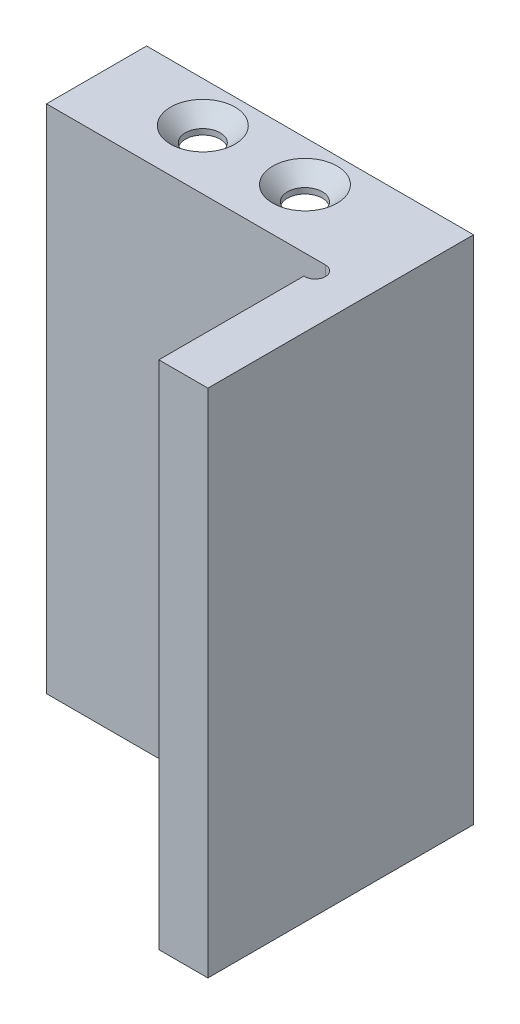
ISO-10303-21;
HEADER;
FILE_DESCRIPTION(('STEP AP214'),'2;1');
FILE_NAME('part.step','',(''),(''),'','','');
FILE_SCHEMA(('AUTOMOTIVE_DESIGN { 1 0 10303 214 1 1 1 1 }'));
ENDSEC;
DATA;
#1=APPLICATION_CONTEXT('core data for automotive mechanical design processes');
#2=APPLICATION_PROTOCOL_DEFINITION('international standard','automotive_design',2000,#1);
#3=PRODUCT_CONTEXT('',#1,'mechanical');
#4=PRODUCT('Part','Part','',(#3));
#5=PRODUCT_RELATED_PRODUCT_CATEGORY('part','',(#4));
#6=PRODUCT_DEFINITION_FORMATION('','',#4);
#7=PRODUCT_DEFINITION_CONTEXT('part definition',#1,'design');
#8=PRODUCT_DEFINITION('design','',#6,#7);
#9=PRODUCT_DEFINITION_SHAPE('','',#8);
#10=(LENGTH_UNIT() NAMED_UNIT(*) SI_UNIT(.MILLI.,.METRE.));
#11=(NAMED_UNIT(*) PLANE_ANGLE_UNIT() SI_UNIT($,.RADIAN.));
#12=(NAMED_UNIT(*) SI_UNIT($,.STERADIAN.) SOLID_ANGLE_UNIT());
#13=UNCERTAINTY_MEASURE_WITH_UNIT(LENGTH_MEASURE(1.E-05),#10,'distance_accuracy_value','');
#14=(GEOMETRIC_REPRESENTATION_CONTEXT(3) GLOBAL_UNCERTAINTY_ASSIGNED_CONTEXT((#13)) GLOBAL_UNIT_ASSIGNED_CONTEXT((#10,
#11,#12)) REPRESENTATION_CONTEXT('',''));
#15=CARTESIAN_POINT('',(0.,0.,0.));
#16=DIRECTION('',(0.,0.,1.));
#17=DIRECTION('',(1.,0.,0.));
#18=AXIS2_PLACEMENT_3D('',#15,#16,#17);
#19=CARTESIAN_POINT('',(11.2,-48.,-3.19999999999997));
#20=DIRECTION('',(0.,0.,-1.));
#21=DIRECTION('',(-1.,0.,0.));
#22=AXIS2_PLACEMENT_3D('',#19,#20,#21);
#23=PLANE('',#22);
#24=DIRECTION('',(-1.,0.,0.));
#25=VECTOR('',#24,1.);
#26=CARTESIAN_POINT('',(11.2,-48.,-3.19999999999997));
#27=LINE('',#26,#25);
#28=CARTESIAN_POINT('',(11.3,-48.,-3.19999999999997));
#29=VERTEX_POINT('',#28);
#30=CARTESIAN_POINT('',(-16.,-48.,-3.19999999999997));
#31=VERTEX_POINT('',#30);
#32=EDGE_CURVE('E144',#29,#31,#27,.T.);
#33=ORIENTED_EDGE('',*,*,#32,.F.);
#34=DIRECTION('',(0.,1.,0.));
#35=VECTOR('',#34,1.);
#36=CARTESIAN_POINT('',(11.3,2.,-3.19999999999997));
#37=LINE('',#36,#35);
#38=CARTESIAN_POINT('',(11.3,2.,-3.2));
#39=VERTEX_POINT('',#38);
#40=EDGE_CURVE('E208',#29,#39,#37,.T.);
#41=ORIENTED_EDGE('',*,*,#40,.T.);
#42=DIRECTION('',(-1.,0.,0.));
#43=VECTOR('',#42,1.);
#44=CARTESIAN_POINT('',(11.2,2.,-3.2));
#45=LINE('',#44,#43);
#46=CARTESIAN_POINT('',(-16.,2.,-3.2));
#47=VERTEX_POINT('',#46);
#48=EDGE_CURVE('E156',#39,#47,#45,.T.);
#49=ORIENTED_EDGE('',*,*,#48,.T.);
#50=DIRECTION('',(0.,1.,0.));
#51=VECTOR('',#50,1.);
#52=CARTESIAN_POINT('',(-16.,-48.,-3.19999999999997));
#53=LINE('',#52,#51);
#54=EDGE_CURVE('E146',#31,#47,#53,.T.);
#55=ORIENTED_EDGE('',*,*,#54,.F.);
#56=EDGE_LOOP('',(#33,#41,#49,#55));
#57=FACE_BOUND('',#56,.T.);
#58=CARTESIAN_POINT('',(-1.,-42.5,-3.19999999999997));
#59=DIRECTION('',(0.,0.,1.));
#60=DIRECTION('',(1.,0.,0.));
#61=AXIS2_PLACEMENT_3D('',#58,#59,#60);
#62=CIRCLE('',#61,1.6);
#63=CARTESIAN_POINT('',(0.599999999999995,-42.5,-3.19999999999997));
#64=VERTEX_POINT('',#63);
#65=EDGE_CURVE('E137',#64,#64,#62,.T.);
#66=ORIENTED_EDGE('',*,*,#65,.F.);
#67=EDGE_LOOP('',(#66));
#68=FACE_BOUND('',#67,.T.);
#69=ADVANCED_FACE('F32',(#57,#68),#23,.F.);
#70=CARTESIAN_POINT('',(0.,0.,0.));
#71=DIRECTION('',(0.,1.,0.));
#72=DIRECTION('',(0.,0.,1.));
#73=AXIS2_PLACEMENT_3D('',#70,#71,#72);
#74=PLANE('',#73);
#75=CARTESIAN_POINT('',(3.5,0.,-9.));
#76=DIRECTION('',(0.,1.,0.));
#77=DIRECTION('',(0.,0.,1.));
#78=AXIS2_PLACEMENT_3D('',#75,#76,#77);
#79=CIRCLE('',#78,1.69999999999999);
#80=CARTESIAN_POINT('',(3.5,0.,-7.30000000000001));
#81=VERTEX_POINT('',#80);
#82=EDGE_CURVE('E186',#81,#81,#79,.T.);
#83=ORIENTED_EDGE('',*,*,#82,.T.);
#84=EDGE_LOOP('',(#83));
#85=FACE_BOUND('',#84,.T.);
#86=CARTESIAN_POINT('',(-6.5,0.,-9.));
#87=DIRECTION('',(0.,1.,0.));
#88=DIRECTION('',(0.,0.,1.));
#89=AXIS2_PLACEMENT_3D('',#86,#87,#88);
#90=CIRCLE('',#89,1.69999999999999);
#91=CARTESIAN_POINT('',(-6.5,0.,-7.3));
#92=VERTEX_POINT('',#91);
#93=EDGE_CURVE('E179',#92,#92,#90,.T.);
#94=ORIENTED_EDGE('',*,*,#93,.T.);
#95=EDGE_LOOP('',(#94));
#96=FACE_BOUND('',#95,.T.);
#97=DIRECTION('',(0.,0.,-1.));
#98=VECTOR('',#97,1.);
#99=CARTESIAN_POINT('',(14.,0.,-5.));
#100=LINE('',#99,#98);
#101=CARTESIAN_POINT('',(14.,0.,-5.));
#102=VERTEX_POINT('',#101);
#103=CARTESIAN_POINT('',(14.,0.,-13.));
#104=VERTEX_POINT('',#103);
#105=EDGE_CURVE('E155',#102,#104,#100,.T.);
#106=ORIENTED_EDGE('',*,*,#105,.F.);
#107=DIRECTION('',(1.,0.,0.));
#108=VECTOR('',#107,1.);
#109=CARTESIAN_POINT('',(14.,0.,-5.));
#110=LINE('',#109,#108);
#111=CARTESIAN_POINT('',(-16.,0.,-5.00000000000001));
#112=VERTEX_POINT('',#111);
#113=EDGE_CURVE('E152',#112,#102,#110,.T.);
#114=ORIENTED_EDGE('',*,*,#113,.F.);
#115=DIRECTION('',(0.,0.,1.));
#116=VECTOR('',#115,1.);
#117=CARTESIAN_POINT('',(-16.,0.,-13.));
#118=LINE('',#117,#116);
#119=CARTESIAN_POINT('',(-16.,0.,-13.));
#120=VERTEX_POINT('',#119);
#121=EDGE_CURVE('E198',#120,#112,#118,.T.);
#122=ORIENTED_EDGE('',*,*,#121,.F.);
#123=DIRECTION('',(-1.,0.,0.));
#124=VECTOR('',#123,1.);
#125=CARTESIAN_POINT('',(-16.,0.,-13.));
#126=LINE('',#125,#124);
#127=EDGE_CURVE('E191',#104,#120,#126,.T.);
#128=ORIENTED_EDGE('',*,*,#127,.F.);
#129=EDGE_LOOP('',(#106,#114,#122,#128));
#130=FACE_BOUND('',#129,.T.);
#131=ADVANCED_FACE('F266',(#85,#96,#130),#74,.F.);
#132=CARTESIAN_POINT('',(-16.,2.,-13.));
#133=DIRECTION('',(1.,0.,0.));
#134=DIRECTION('',(0.,0.,-1.));
#135=AXIS2_PLACEMENT_3D('',#132,#133,#134);
#136=PLANE('',#135);
#137=ORIENTED_EDGE('',*,*,#54,.T.);
#138=DIRECTION('',(0.,0.,1.));
#139=VECTOR('',#138,1.);
#140=CARTESIAN_POINT('',(-16.,2.,-13.));
#141=LINE('',#140,#139);
#142=CARTESIAN_POINT('',(-16.,2.,-13.));
#143=VERTEX_POINT('',#142);
#144=EDGE_CURVE('E187',#143,#47,#141,.T.);
#145=ORIENTED_EDGE('',*,*,#144,.F.);
#146=DIRECTION('',(0.,-1.,0.));
#147=VECTOR('',#146,1.);
#148=CARTESIAN_POINT('',(-16.,2.,-13.));
#149=LINE('',#148,#147);
#150=EDGE_CURVE('E197',#143,#120,#149,.T.);
#151=ORIENTED_EDGE('',*,*,#150,.T.);
#152=ORIENTED_EDGE('',*,*,#121,.T.);
#153=DIRECTION('',(0.,1.,0.));
#154=VECTOR('',#153,1.);
#155=CARTESIAN_POINT('',(-16.,-48.,-5.00000000000001));
#156=LINE('',#155,#154);
#157=CARTESIAN_POINT('',(-16.,-48.,-5.00000000000001));
#158=VERTEX_POINT('',#157);
#159=EDGE_CURVE('E170',#158,#112,#156,.T.);
#160=ORIENTED_EDGE('',*,*,#159,.F.);
#161=DIRECTION('',(0.,0.,-1.));
#162=VECTOR('',#161,1.);
#163=CARTESIAN_POINT('',(-16.,-48.,-5.00000000000001));
#164=LINE('',#163,#162);
#165=EDGE_CURVE('E159',#31,#158,#164,.T.);
#166=ORIENTED_EDGE('',*,*,#165,.F.);
#167=EDGE_LOOP('',(#137,#145,#151,#152,#160,#166));
#168=FACE_BOUND('',#167,.T.);
#169=ADVANCED_FACE('F237',(#168),#136,.F.);
#170=CARTESIAN_POINT('',(-16.,2.,13.));
#171=DIRECTION('',(0.,0.,-1.));
#172=DIRECTION('',(-1.,0.,0.));
#173=AXIS2_PLACEMENT_3D('',#170,#171,#172);
#174=PLANE('',#173);
#175=DIRECTION('',(1.,0.,0.));
#176=VECTOR('',#175,1.);
#177=CARTESIAN_POINT('',(-16.,2.,13.));
#178=LINE('',#177,#176);
#179=CARTESIAN_POINT('',(11.2,2.,13.));
#180=VERTEX_POINT('',#179);
#181=CARTESIAN_POINT('',(16.,2.,13.));
#182=VERTEX_POINT('',#181);
#183=EDGE_CURVE('E190',#180,#182,#178,.T.);
#184=ORIENTED_EDGE('',*,*,#183,.F.);
#185=DIRECTION('',(0.,1.,0.));
#186=VECTOR('',#185,1.);
#187=CARTESIAN_POINT('',(11.2,-48.,13.));
#188=LINE('',#187,#186);
#189=CARTESIAN_POINT('',(11.2,-48.,13.));
#190=VERTEX_POINT('',#189);
#191=EDGE_CURVE('E162',#190,#180,#188,.T.);
#192=ORIENTED_EDGE('',*,*,#191,.F.);
#193=DIRECTION('',(-1.,0.,0.));
#194=VECTOR('',#193,1.);
#195=CARTESIAN_POINT('',(11.2,-48.,13.));
#196=LINE('',#195,#194);
#197=CARTESIAN_POINT('',(16.,-48.,13.));
#198=VERTEX_POINT('',#197);
#199=EDGE_CURVE('E142',#198,#190,#196,.T.);
#200=ORIENTED_EDGE('',*,*,#199,.F.);
#201=DIRECTION('',(0.,-1.,0.));
#202=VECTOR('',#201,1.);
#203=CARTESIAN_POINT('',(16.,2.,13.));
#204=LINE('',#203,#202);
#205=EDGE_CURVE('E206',#182,#198,#204,.T.);
#206=ORIENTED_EDGE('',*,*,#205,.F.);
#207=EDGE_LOOP('',(#184,#192,#200,#206));
#208=FACE_BOUND('',#207,.T.);
#209=ADVANCED_FACE('F255',(#208),#174,.F.);
#210=CARTESIAN_POINT('',(16.,2.,-13.));
#211=DIRECTION('',(-1.,0.,0.));
#212=DIRECTION('',(0.,0.,1.));
#213=AXIS2_PLACEMENT_3D('',#210,#211,#212);
#214=PLANE('',#213);
#215=ORIENTED_EDGE('',*,*,#205,.T.);
#216=DIRECTION('',(0.,0.,1.));
#217=VECTOR('',#216,1.);
#218=CARTESIAN_POINT('',(16.,-48.,13.));
#219=LINE('',#218,#217);
#220=CARTESIAN_POINT('',(16.,-48.,-13.));
#221=VERTEX_POINT('',#220);
#222=EDGE_CURVE('E148',#221,#198,#219,.T.);
#223=ORIENTED_EDGE('',*,*,#222,.F.);
#224=DIRECTION('',(0.,-1.,0.));
#225=VECTOR('',#224,1.);
#226=CARTESIAN_POINT('',(16.,2.,-13.));
#227=LINE('',#226,#225);
#228=CARTESIAN_POINT('',(16.,2.,-13.));
#229=VERTEX_POINT('',#228);
#230=EDGE_CURVE('E204',#229,#221,#227,.T.);
#231=ORIENTED_EDGE('',*,*,#230,.F.);
#232=DIRECTION('',(0.,0.,-1.));
#233=VECTOR('',#232,1.);
#234=CARTESIAN_POINT('',(16.,2.,-13.));
#235=LINE('',#234,#233);
#236=EDGE_CURVE('E193',#182,#229,#235,.T.);
#237=ORIENTED_EDGE('',*,*,#236,.F.);
#238=EDGE_LOOP('',(#215,#223,#231,#237));
#239=FACE_BOUND('',#238,.T.);
#240=ADVANCED_FACE('F307',(#239),#214,.F.);
#241=CARTESIAN_POINT('',(-16.,2.,-13.));
#242=DIRECTION('',(0.,0.,1.));
#243=DIRECTION('',(1.,0.,0.));
#244=AXIS2_PLACEMENT_3D('',#241,#242,#243);
#245=PLANE('',#244);
#246=ORIENTED_EDGE('',*,*,#230,.T.);
#247=DIRECTION('',(1.,0.,0.));
#248=VECTOR('',#247,1.);
#249=CARTESIAN_POINT('',(14.,-48.,-13.));
#250=LINE('',#249,#248);
#251=CARTESIAN_POINT('',(14.,-48.,-13.));
#252=VERTEX_POINT('',#251);
#253=EDGE_CURVE('E246',#252,#221,#250,.T.);
#254=ORIENTED_EDGE('',*,*,#253,.F.);
#255=DIRECTION('',(0.,1.,0.));
#256=VECTOR('',#255,1.);
#257=CARTESIAN_POINT('',(14.,-48.,-13.));
#258=LINE('',#257,#256);
#259=EDGE_CURVE('E164',#252,#104,#258,.T.);
#260=ORIENTED_EDGE('',*,*,#259,.T.);
#261=ORIENTED_EDGE('',*,*,#127,.T.);
#262=ORIENTED_EDGE('',*,*,#150,.F.);
#263=DIRECTION('',(-1.,0.,0.));
#264=VECTOR('',#263,1.);
#265=CARTESIAN_POINT('',(-16.,2.,-13.));
#266=LINE('',#265,#264);
#267=EDGE_CURVE('E195',#229,#143,#266,.T.);
#268=ORIENTED_EDGE('',*,*,#267,.F.);
#269=EDGE_LOOP('',(#246,#254,#260,#261,#262,#268));
#270=FACE_BOUND('',#269,.T.);
#271=ADVANCED_FACE('F303',(#270),#245,.F.);
#272=CARTESIAN_POINT('',(0.,2.,0.));
#273=DIRECTION('',(0.,1.,0.));
#274=DIRECTION('',(0.,0.,1.));
#275=AXIS2_PLACEMENT_3D('',#272,#273,#274);
#276=PLANE('',#275);
#277=CARTESIAN_POINT('',(11.3,2.,-2.19999999999997));
#278=DIRECTION('',(0.,1.,0.));
#279=DIRECTION('',(0.,0.,1.));
#280=AXIS2_PLACEMENT_3D('',#277,#278,#279);
#281=CIRCLE('',#280,1.);
#282=CARTESIAN_POINT('',(12.3,2.,-2.19999999999997));
#283=VERTEX_POINT('',#282);
#284=EDGE_CURVE('E54',#39,#283,#281,.F.);
#285=ORIENTED_EDGE('',*,*,#284,.T.);
#286=CARTESIAN_POINT('',(11.3,2.,-2.2));
#287=DIRECTION('',(0.,1.,0.));
#288=DIRECTION('',(0.,0.,1.));
#289=AXIS2_PLACEMENT_3D('',#286,#287,#288);
#290=CIRCLE('',#289,1.);
#291=CARTESIAN_POINT('',(11.3,2.,-1.2));
#292=VERTEX_POINT('',#291);
#293=EDGE_CURVE('E41',#283,#292,#290,.F.);
#294=ORIENTED_EDGE('',*,*,#293,.T.);
#295=DIRECTION('',(1.,0.,0.));
#296=VECTOR('',#295,1.);
#297=CARTESIAN_POINT('',(11.2,2.,-1.2));
#298=LINE('',#297,#296);
#299=CARTESIAN_POINT('',(11.2,2.,-1.2));
#300=VERTEX_POINT('',#299);
#301=EDGE_CURVE('E128',#300,#292,#298,.T.);
#302=ORIENTED_EDGE('',*,*,#301,.F.);
#303=DIRECTION('',(0.,0.,-1.));
#304=VECTOR('',#303,1.);
#305=CARTESIAN_POINT('',(11.2,2.,-3.2));
#306=LINE('',#305,#304);
#307=EDGE_CURVE('E136',#180,#300,#306,.T.);
#308=ORIENTED_EDGE('',*,*,#307,.F.);
#309=ORIENTED_EDGE('',*,*,#183,.T.);
#310=ORIENTED_EDGE('',*,*,#236,.T.);
#311=ORIENTED_EDGE('',*,*,#267,.T.);
#312=ORIENTED_EDGE('',*,*,#144,.T.);
#313=ORIENTED_EDGE('',*,*,#48,.F.);
#314=EDGE_LOOP('',(#285,#294,#302,#308,#309,#310,#311,#312,#313));
#315=FACE_BOUND('',#314,.T.);
#316=CARTESIAN_POINT('',(-6.5,2.,-9.));
#317=DIRECTION('',(0.,1.,0.));
#318=DIRECTION('',(0.,0.,1.));
#319=AXIS2_PLACEMENT_3D('',#316,#317,#318);
#320=CIRCLE('',#319,3.15);
#321=CARTESIAN_POINT('',(-6.5,2.,-5.85));
#322=VERTEX_POINT('',#321);
#323=EDGE_CURVE('E173',#322,#322,#320,.T.);
#324=ORIENTED_EDGE('',*,*,#323,.F.);
#325=EDGE_LOOP('',(#324));
#326=FACE_BOUND('',#325,.T.);
#327=CARTESIAN_POINT('',(3.5,2.,-9.));
#328=DIRECTION('',(0.,1.,0.));
#329=DIRECTION('',(0.,0.,1.));
#330=AXIS2_PLACEMENT_3D('',#327,#328,#329);
#331=CIRCLE('',#330,3.15);
#332=CARTESIAN_POINT('',(3.5,2.,-5.85));
#333=VERTEX_POINT('',#332);
#334=EDGE_CURVE('E180',#333,#333,#331,.T.);
#335=ORIENTED_EDGE('',*,*,#334,.F.);
#336=EDGE_LOOP('',(#335));
#337=FACE_BOUND('',#336,.T.);
#338=ADVANCED_FACE('F219',(#315,#326,#337),#276,.T.);
#339=CARTESIAN_POINT('',(3.5,2.,-9.));
#340=DIRECTION('',(0.,1.,0.));
#341=DIRECTION('',(0.,0.,1.));
#342=AXIS2_PLACEMENT_3D('',#339,#340,#341);
#343=CYLINDRICAL_SURFACE('',#342,1.69999999999999);
#344=CARTESIAN_POINT('',(3.5,0.549999999999999,-9.));
#345=DIRECTION('',(0.,1.,0.));
#346=DIRECTION('',(0.,0.,1.));
#347=AXIS2_PLACEMENT_3D('',#344,#345,#346);
#348=CIRCLE('',#347,1.7);
#349=CARTESIAN_POINT('',(3.5,0.549999999999999,-7.3));
#350=VERTEX_POINT('',#349);
#351=EDGE_CURVE('E183',#350,#350,#348,.T.);
#352=ORIENTED_EDGE('',*,*,#351,.T.);
#353=EDGE_LOOP('',(#352));
#354=FACE_BOUND('',#353,.T.);
#355=ORIENTED_EDGE('',*,*,#82,.F.);
#356=EDGE_LOOP('',(#355));
#357=FACE_BOUND('',#356,.T.);
#358=ADVANCED_FACE('F297',(#354,#357),#343,.F.);
#359=CARTESIAN_POINT('',(3.5,2.,-9.));
#360=DIRECTION('',(0.,1.,0.));
#361=DIRECTION('',(0.,0.,1.));
#362=AXIS2_PLACEMENT_3D('',#359,#360,#361);
#363=CONICAL_SURFACE('',#362,3.15,0.785398163397448);
#364=ORIENTED_EDGE('',*,*,#351,.F.);
#365=EDGE_LOOP('',(#364));
#366=FACE_BOUND('',#365,.T.);
#367=ORIENTED_EDGE('',*,*,#334,.T.);
#368=EDGE_LOOP('',(#367));
#369=FACE_BOUND('',#368,.T.);
#370=ADVANCED_FACE('F293',(#366,#369),#363,.F.);
#371=CARTESIAN_POINT('',(-6.5,2.,-9.));
#372=DIRECTION('',(0.,1.,0.));
#373=DIRECTION('',(0.,0.,1.));
#374=AXIS2_PLACEMENT_3D('',#371,#372,#373);
#375=CYLINDRICAL_SURFACE('',#374,1.69999999999999);
#376=CARTESIAN_POINT('',(-6.5,0.549999999999999,-9.));
#377=DIRECTION('',(0.,1.,0.));
#378=DIRECTION('',(0.,0.,1.));
#379=AXIS2_PLACEMENT_3D('',#376,#377,#378);
#380=CIRCLE('',#379,1.7);
#381=CARTESIAN_POINT('',(-6.5,0.549999999999999,-7.3));
#382=VERTEX_POINT('',#381);
#383=EDGE_CURVE('E176',#382,#382,#380,.T.);
#384=ORIENTED_EDGE('',*,*,#383,.T.);
#385=EDGE_LOOP('',(#384));
#386=FACE_BOUND('',#385,.T.);
#387=ORIENTED_EDGE('',*,*,#93,.F.);
#388=EDGE_LOOP('',(#387));
#389=FACE_BOUND('',#388,.T.);
#390=ADVANCED_FACE('F289',(#386,#389),#375,.F.);
#391=CARTESIAN_POINT('',(-6.5,2.,-9.));
#392=DIRECTION('',(0.,1.,0.));
#393=DIRECTION('',(0.,0.,1.));
#394=AXIS2_PLACEMENT_3D('',#391,#392,#393);
#395=CONICAL_SURFACE('',#394,3.15,0.785398163397448);
#396=ORIENTED_EDGE('',*,*,#383,.F.);
#397=EDGE_LOOP('',(#396));
#398=FACE_BOUND('',#397,.T.);
#399=ORIENTED_EDGE('',*,*,#323,.T.);
#400=EDGE_LOOP('',(#399));
#401=FACE_BOUND('',#400,.T.);
#402=ADVANCED_FACE('F285',(#398,#401),#395,.F.);
#403=CARTESIAN_POINT('',(14.,-48.,-5.));
#404=DIRECTION('',(0.,0.,1.));
#405=DIRECTION('',(1.,0.,0.));
#406=AXIS2_PLACEMENT_3D('',#403,#404,#405);
#407=PLANE('',#406);
#408=CARTESIAN_POINT('',(-1.,-42.5,-5.00000000000001));
#409=DIRECTION('',(0.,0.,1.));
#410=DIRECTION('',(1.,0.,0.));
#411=AXIS2_PLACEMENT_3D('',#408,#409,#410);
#412=CIRCLE('',#411,1.6);
#413=CARTESIAN_POINT('',(0.599999999999997,-42.5,-5.00000000000001));
#414=VERTEX_POINT('',#413);
#415=EDGE_CURVE('E257',#414,#414,#412,.T.);
#416=ORIENTED_EDGE('',*,*,#415,.T.);
#417=EDGE_LOOP('',(#416));
#418=FACE_BOUND('',#417,.T.);
#419=ORIENTED_EDGE('',*,*,#113,.T.);
#420=DIRECTION('',(0.,1.,0.));
#421=VECTOR('',#420,1.);
#422=CARTESIAN_POINT('',(14.,-48.,-5.));
#423=LINE('',#422,#421);
#424=CARTESIAN_POINT('',(14.,-48.,-5.));
#425=VERTEX_POINT('',#424);
#426=EDGE_CURVE('E167',#425,#102,#423,.T.);
#427=ORIENTED_EDGE('',*,*,#426,.F.);
#428=DIRECTION('',(1.,0.,0.));
#429=VECTOR('',#428,1.);
#430=CARTESIAN_POINT('',(14.,-48.,-5.));
#431=LINE('',#430,#429);
#432=EDGE_CURVE('E238',#158,#425,#431,.T.);
#433=ORIENTED_EDGE('',*,*,#432,.F.);
#434=ORIENTED_EDGE('',*,*,#159,.T.);
#435=EDGE_LOOP('',(#419,#427,#433,#434));
#436=FACE_BOUND('',#435,.T.);
#437=ADVANCED_FACE('F281',(#418,#436),#407,.F.);
#438=CARTESIAN_POINT('',(14.,-48.,-5.));
#439=DIRECTION('',(1.,0.,0.));
#440=DIRECTION('',(0.,0.,-1.));
#441=AXIS2_PLACEMENT_3D('',#438,#439,#440);
#442=PLANE('',#441);
#443=ORIENTED_EDGE('',*,*,#105,.T.);
#444=ORIENTED_EDGE('',*,*,#259,.F.);
#445=DIRECTION('',(0.,0.,-1.));
#446=VECTOR('',#445,1.);
#447=CARTESIAN_POINT('',(14.,-48.,-5.));
#448=LINE('',#447,#446);
#449=EDGE_CURVE('E240',#425,#252,#448,.T.);
#450=ORIENTED_EDGE('',*,*,#449,.F.);
#451=ORIENTED_EDGE('',*,*,#426,.T.);
#452=EDGE_LOOP('',(#443,#444,#450,#451));
#453=FACE_BOUND('',#452,.T.);
#454=ADVANCED_FACE('F278',(#453),#442,.F.);
#455=CARTESIAN_POINT('',(11.2,-48.,-3.19999999999997));
#456=DIRECTION('',(1.,0.,0.));
#457=DIRECTION('',(0.,0.,-1.));
#458=AXIS2_PLACEMENT_3D('',#455,#456,#457);
#459=PLANE('',#458);
#460=ORIENTED_EDGE('',*,*,#307,.T.);
#461=DIRECTION('',(0.,1.,0.));
#462=VECTOR('',#461,1.);
#463=CARTESIAN_POINT('',(11.2,-48.,-1.2));
#464=LINE('',#463,#462);
#465=CARTESIAN_POINT('',(11.2,-48.,-1.2));
#466=VERTEX_POINT('',#465);
#467=EDGE_CURVE('E123',#466,#300,#464,.T.);
#468=ORIENTED_EDGE('',*,*,#467,.F.);
#469=DIRECTION('',(0.,0.,-1.));
#470=VECTOR('',#469,1.);
#471=CARTESIAN_POINT('',(11.2,-48.,-3.19999999999997));
#472=LINE('',#471,#470);
#473=EDGE_CURVE('E134',#190,#466,#472,.T.);
#474=ORIENTED_EDGE('',*,*,#473,.F.);
#475=ORIENTED_EDGE('',*,*,#191,.T.);
#476=EDGE_LOOP('',(#460,#468,#474,#475));
#477=FACE_BOUND('',#476,.T.);
#478=ADVANCED_FACE('F133',(#477),#459,.F.);
#479=CARTESIAN_POINT('',(0.,-48.,0.));
#480=DIRECTION('',(0.,-1.,0.));
#481=DIRECTION('',(0.,0.,-1.));
#482=AXIS2_PLACEMENT_3D('',#479,#480,#481);
#483=PLANE('',#482);
#484=DIRECTION('',(1.,0.,0.));
#485=VECTOR('',#484,1.);
#486=CARTESIAN_POINT('',(11.2,-48.,-1.2));
#487=LINE('',#486,#485);
#488=CARTESIAN_POINT('',(11.3,-48.,-1.2));
#489=VERTEX_POINT('',#488);
#490=EDGE_CURVE('E119',#466,#489,#487,.T.);
#491=ORIENTED_EDGE('',*,*,#490,.T.);
#492=CARTESIAN_POINT('',(11.3,-48.,-2.2));
#493=DIRECTION('',(0.,-1.,0.));
#494=DIRECTION('',(0.,0.,-1.));
#495=AXIS2_PLACEMENT_3D('',#492,#493,#494);
#496=CIRCLE('',#495,1.);
#497=CARTESIAN_POINT('',(12.3,-48.,-2.19999999999997));
#498=VERTEX_POINT('',#497);
#499=EDGE_CURVE('E11',#489,#498,#496,.F.);
#500=ORIENTED_EDGE('',*,*,#499,.T.);
#501=CARTESIAN_POINT('',(11.3,-48.,-2.19999999999997));
#502=DIRECTION('',(0.,-1.,0.));
#503=DIRECTION('',(0.,0.,-1.));
#504=AXIS2_PLACEMENT_3D('',#501,#502,#503);
#505=CIRCLE('',#504,1.);
#506=EDGE_CURVE('E217',#498,#29,#505,.F.);
#507=ORIENTED_EDGE('',*,*,#506,.T.);
#508=ORIENTED_EDGE('',*,*,#32,.T.);
#509=ORIENTED_EDGE('',*,*,#165,.T.);
#510=ORIENTED_EDGE('',*,*,#432,.T.);
#511=ORIENTED_EDGE('',*,*,#449,.T.);
#512=ORIENTED_EDGE('',*,*,#253,.T.);
#513=ORIENTED_EDGE('',*,*,#222,.T.);
#514=ORIENTED_EDGE('',*,*,#199,.T.);
#515=ORIENTED_EDGE('',*,*,#473,.T.);
#516=EDGE_LOOP('',(#491,#500,#507,#508,#509,#510,#511,#512,#513,#514,#515));
#517=FACE_BOUND('',#516,.T.);
#518=ADVANCED_FACE('F139',(#517),#483,.T.);
#519=CARTESIAN_POINT('',(-1.,-42.5,-3.19999999999997));
#520=DIRECTION('',(0.,0.,1.));
#521=DIRECTION('',(1.,0.,0.));
#522=AXIS2_PLACEMENT_3D('',#519,#520,#521);
#523=CYLINDRICAL_SURFACE('',#522,1.6);
#524=ORIENTED_EDGE('',*,*,#415,.F.);
#525=EDGE_LOOP('',(#524));
#526=FACE_BOUND('',#525,.T.);
#527=ORIENTED_EDGE('',*,*,#65,.T.);
#528=EDGE_LOOP('',(#527));
#529=FACE_BOUND('',#528,.T.);
#530=ADVANCED_FACE('F264',(#526,#529),#523,.F.);
#531=CARTESIAN_POINT('',(11.2,-48.,-1.2));
#532=DIRECTION('',(0.,0.,1.));
#533=DIRECTION('',(1.,0.,0.));
#534=AXIS2_PLACEMENT_3D('',#531,#532,#533);
#535=PLANE('',#534);
#536=ORIENTED_EDGE('',*,*,#301,.T.);
#537=DIRECTION('',(0.,1.,0.));
#538=VECTOR('',#537,1.);
#539=CARTESIAN_POINT('',(11.3,-48.,-1.2));
#540=LINE('',#539,#538);
#541=EDGE_CURVE('E126',#292,#489,#540,.F.);
#542=ORIENTED_EDGE('',*,*,#541,.T.);
#543=ORIENTED_EDGE('',*,*,#490,.F.);
#544=ORIENTED_EDGE('',*,*,#467,.T.);
#545=EDGE_LOOP('',(#536,#542,#543,#544));
#546=FACE_BOUND('',#545,.T.);
#547=ADVANCED_FACE('F122',(#546),#535,.F.);
#548=CARTESIAN_POINT('',(11.3,-48.,-2.2));
#549=DIRECTION('',(0.,-1.,0.));
#550=DIRECTION('',(0.,0.,-1.));
#551=AXIS2_PLACEMENT_3D('',#548,#549,#550);
#552=CYLINDRICAL_SURFACE('',#551,1.);
#553=DIRECTION('',(0.,1.,0.));
#554=VECTOR('',#553,1.);
#555=CARTESIAN_POINT('',(12.3,2.,-2.2));
#556=LINE('',#555,#554);
#557=EDGE_CURVE('E36',#498,#283,#556,.T.);
#558=ORIENTED_EDGE('',*,*,#557,.F.);
#559=ORIENTED_EDGE('',*,*,#499,.F.);
#560=ORIENTED_EDGE('',*,*,#541,.F.);
#561=ORIENTED_EDGE('',*,*,#293,.F.);
#562=EDGE_LOOP('',(#558,#559,#560,#561));
#563=FACE_BOUND('',#562,.T.);
#564=ADVANCED_FACE('F34',(#563),#552,.F.);
#565=CARTESIAN_POINT('',(11.3,-48.,-2.19999999999997));
#566=DIRECTION('',(0.,-1.,0.));
#567=DIRECTION('',(0.,0.,-1.));
#568=AXIS2_PLACEMENT_3D('',#565,#566,#567);
#569=CYLINDRICAL_SURFACE('',#568,1.);
#570=ORIENTED_EDGE('',*,*,#506,.F.);
#571=ORIENTED_EDGE('',*,*,#557,.T.);
#572=ORIENTED_EDGE('',*,*,#284,.F.);
#573=ORIENTED_EDGE('',*,*,#40,.F.);
#574=EDGE_LOOP('',(#570,#571,#572,#573));
#575=FACE_BOUND('',#574,.T.);
#576=ADVANCED_FACE('F227',(#575),#569,.F.);
#577=CLOSED_SHELL('',(#69,#131,#169,#209,#240,#271,#338,#358,#370,#390,#402,#437,#454,#478,#518,
#530,#547,#564,#576));
#578=MANIFOLD_SOLID_BREP('B2',#577);
#579=ADVANCED_BREP_SHAPE_REPRESENTATION('',(#18,#578),#14);
#580=SHAPE_DEFINITION_REPRESENTATION(#9,#579);
ENDSEC;
END-ISO-10303-21;
